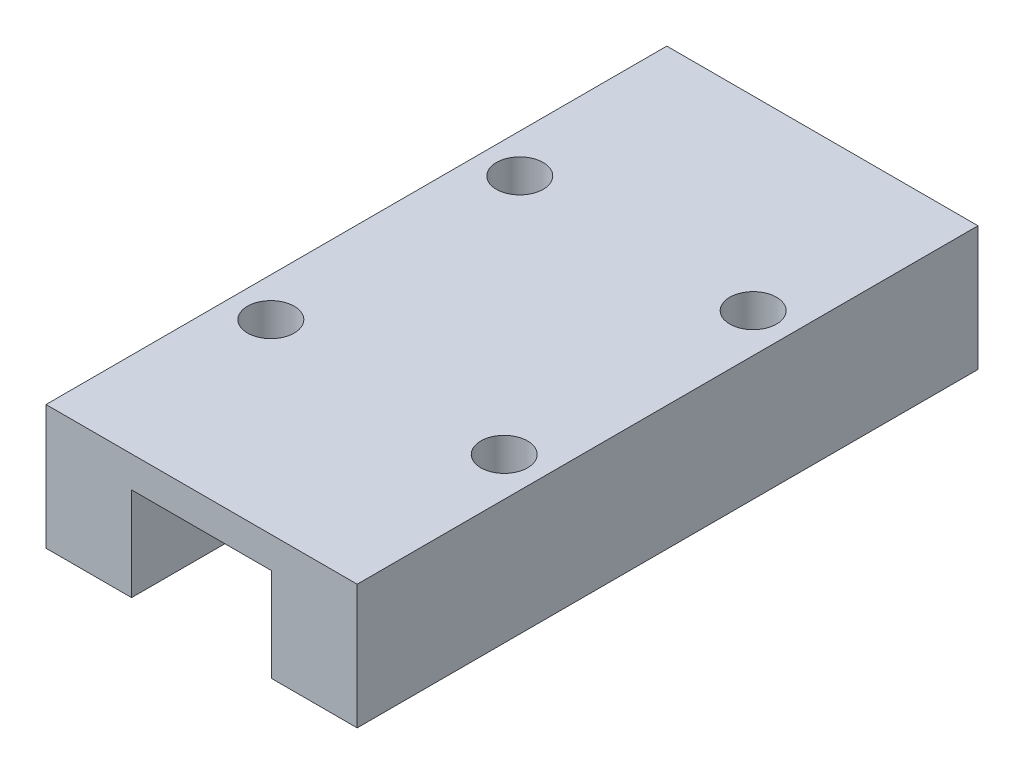
ISO-10303-21;
HEADER;
FILE_DESCRIPTION(('STEP AP214'),'2;1');
FILE_NAME('part.step','',(''),(''),'','','');
FILE_SCHEMA(('AUTOMOTIVE_DESIGN { 1 0 10303 214 1 1 1 1 }'));
ENDSEC;
DATA;
#1=APPLICATION_CONTEXT('core data for automotive mechanical design processes');
#2=APPLICATION_PROTOCOL_DEFINITION('international standard','automotive_design',2000,#1);
#3=PRODUCT_CONTEXT('',#1,'mechanical');
#4=PRODUCT('Part','Part','',(#3));
#5=PRODUCT_RELATED_PRODUCT_CATEGORY('part','',(#4));
#6=PRODUCT_DEFINITION_FORMATION('','',#4);
#7=PRODUCT_DEFINITION_CONTEXT('part definition',#1,'design');
#8=PRODUCT_DEFINITION('design','',#6,#7);
#9=PRODUCT_DEFINITION_SHAPE('','',#8);
#10=(LENGTH_UNIT() NAMED_UNIT(*) SI_UNIT(.MILLI.,.METRE.));
#11=(NAMED_UNIT(*) PLANE_ANGLE_UNIT() SI_UNIT($,.RADIAN.));
#12=(NAMED_UNIT(*) SI_UNIT($,.STERADIAN.) SOLID_ANGLE_UNIT());
#13=UNCERTAINTY_MEASURE_WITH_UNIT(LENGTH_MEASURE(1.E-05),#10,'distance_accuracy_value','');
#14=(GEOMETRIC_REPRESENTATION_CONTEXT(3) GLOBAL_UNCERTAINTY_ASSIGNED_CONTEXT((#13)) GLOBAL_UNIT_ASSIGNED_CONTEXT((#10,
#11,#12)) REPRESENTATION_CONTEXT('',''));
#15=CARTESIAN_POINT('',(0.,0.,0.));
#16=DIRECTION('',(0.,0.,1.));
#17=DIRECTION('',(1.,0.,0.));
#18=AXIS2_PLACEMENT_3D('',#15,#16,#17);
#19=CARTESIAN_POINT('',(0.,0.,0.));
#20=DIRECTION('',(0.,1.,0.));
#21=DIRECTION('',(0.,0.,1.));
#22=AXIS2_PLACEMENT_3D('',#19,#20,#21);
#23=PLANE('',#22);
#24=CARTESIAN_POINT('',(-7.5,0.,8.));
#25=DIRECTION('',(0.,1.,0.));
#26=DIRECTION('',(0.,0.,-1.));
#27=AXIS2_PLACEMENT_3D('',#24,#25,#26);
#28=CIRCLE('',#27,1.5);
#29=CARTESIAN_POINT('',(-7.5,0.,6.5));
#30=VERTEX_POINT('',#29);
#31=EDGE_CURVE('E189',#30,#30,#28,.T.);
#32=ORIENTED_EDGE('',*,*,#31,.T.);
#33=EDGE_LOOP('',(#32));
#34=FACE_BOUND('',#33,.T.);
#35=CARTESIAN_POINT('',(-7.5,0.,-8.));
#36=DIRECTION('',(0.,1.,0.));
#37=DIRECTION('',(0.,0.,1.));
#38=AXIS2_PLACEMENT_3D('',#35,#36,#37);
#39=CIRCLE('',#38,1.5);
#40=CARTESIAN_POINT('',(-7.5,0.,-6.5));
#41=VERTEX_POINT('',#40);
#42=EDGE_CURVE('E181',#41,#41,#39,.T.);
#43=ORIENTED_EDGE('',*,*,#42,.T.);
#44=EDGE_LOOP('',(#43));
#45=FACE_BOUND('',#44,.T.);
#46=DIRECTION('',(-1.,0.,0.));
#47=VECTOR('',#46,1.);
#48=CARTESIAN_POINT('',(-10.,0.,-19.95));
#49=LINE('',#48,#47);
#50=CARTESIAN_POINT('',(-4.5,0.,-19.95));
#51=VERTEX_POINT('',#50);
#52=CARTESIAN_POINT('',(-10.,0.,-19.95));
#53=VERTEX_POINT('',#52);
#54=EDGE_CURVE('E135',#51,#53,#49,.T.);
#55=ORIENTED_EDGE('',*,*,#54,.F.);
#56=DIRECTION('',(0.,0.,1.));
#57=VECTOR('',#56,1.);
#58=CARTESIAN_POINT('',(-4.5,0.,-40.05));
#59=LINE('',#58,#57);
#60=CARTESIAN_POINT('',(-4.5,0.,19.95));
#61=VERTEX_POINT('',#60);
#62=EDGE_CURVE('E120',#51,#61,#59,.T.);
#63=ORIENTED_EDGE('',*,*,#62,.T.);
#64=DIRECTION('',(1.,0.,0.));
#65=VECTOR('',#64,1.);
#66=CARTESIAN_POINT('',(-10.,0.,19.95));
#67=LINE('',#66,#65);
#68=CARTESIAN_POINT('',(-10.,0.,19.95));
#69=VERTEX_POINT('',#68);
#70=EDGE_CURVE('E134',#69,#61,#67,.T.);
#71=ORIENTED_EDGE('',*,*,#70,.F.);
#72=DIRECTION('',(0.,0.,1.));
#73=VECTOR('',#72,1.);
#74=CARTESIAN_POINT('',(-10.,0.,-19.95));
#75=LINE('',#74,#73);
#76=EDGE_CURVE('E149',#53,#69,#75,.T.);
#77=ORIENTED_EDGE('',*,*,#76,.F.);
#78=EDGE_LOOP('',(#55,#63,#71,#77));
#79=FACE_BOUND('',#78,.T.);
#80=ADVANCED_FACE('F43',(#34,#45,#79),#23,.F.);
#81=CARTESIAN_POINT('',(0.,8.,0.));
#82=DIRECTION('',(0.,1.,0.));
#83=DIRECTION('',(0.,0.,1.));
#84=AXIS2_PLACEMENT_3D('',#81,#82,#83);
#85=PLANE('',#84);
#86=CARTESIAN_POINT('',(7.5,8.,8.));
#87=DIRECTION('',(0.,1.,0.));
#88=DIRECTION('',(0.,0.,1.));
#89=AXIS2_PLACEMENT_3D('',#86,#87,#88);
#90=CIRCLE('',#89,1.5);
#91=CARTESIAN_POINT('',(7.5,8.,9.5));
#92=VERTEX_POINT('',#91);
#93=EDGE_CURVE('E193',#92,#92,#90,.T.);
#94=ORIENTED_EDGE('',*,*,#93,.F.);
#95=EDGE_LOOP('',(#94));
#96=FACE_BOUND('',#95,.T.);
#97=CARTESIAN_POINT('',(-7.5,8.,-8.));
#98=DIRECTION('',(0.,1.,0.));
#99=DIRECTION('',(0.,0.,1.));
#100=AXIS2_PLACEMENT_3D('',#97,#98,#99);
#101=CIRCLE('',#100,1.5);
#102=CARTESIAN_POINT('',(-7.5,8.,-6.5));
#103=VERTEX_POINT('',#102);
#104=EDGE_CURVE('E174',#103,#103,#101,.T.);
#105=ORIENTED_EDGE('',*,*,#104,.F.);
#106=EDGE_LOOP('',(#105));
#107=FACE_BOUND('',#106,.T.);
#108=DIRECTION('',(0.,0.,-1.));
#109=VECTOR('',#108,1.);
#110=CARTESIAN_POINT('',(10.,8.,-19.95));
#111=LINE('',#110,#109);
#112=CARTESIAN_POINT('',(10.,8.,19.95));
#113=VERTEX_POINT('',#112);
#114=CARTESIAN_POINT('',(10.,8.,-19.95));
#115=VERTEX_POINT('',#114);
#116=EDGE_CURVE('E144',#113,#115,#111,.T.);
#117=ORIENTED_EDGE('',*,*,#116,.T.);
#118=DIRECTION('',(-1.,0.,0.));
#119=VECTOR('',#118,1.);
#120=CARTESIAN_POINT('',(-10.,8.,-19.95));
#121=LINE('',#120,#119);
#122=CARTESIAN_POINT('',(-10.,8.,-19.95));
#123=VERTEX_POINT('',#122);
#124=EDGE_CURVE('E95',#115,#123,#121,.T.);
#125=ORIENTED_EDGE('',*,*,#124,.T.);
#126=DIRECTION('',(0.,0.,1.));
#127=VECTOR('',#126,1.);
#128=CARTESIAN_POINT('',(-10.,8.,-19.95));
#129=LINE('',#128,#127);
#130=CARTESIAN_POINT('',(-10.,8.,19.95));
#131=VERTEX_POINT('',#130);
#132=EDGE_CURVE('E162',#123,#131,#129,.T.);
#133=ORIENTED_EDGE('',*,*,#132,.T.);
#134=DIRECTION('',(1.,0.,0.));
#135=VECTOR('',#134,1.);
#136=CARTESIAN_POINT('',(-10.,8.,19.95));
#137=LINE('',#136,#135);
#138=EDGE_CURVE('E68',#131,#113,#137,.T.);
#139=ORIENTED_EDGE('',*,*,#138,.T.);
#140=EDGE_LOOP('',(#117,#125,#133,#139));
#141=FACE_BOUND('',#140,.T.);
#142=CARTESIAN_POINT('',(-7.5,8.,8.));
#143=DIRECTION('',(0.,1.,0.));
#144=DIRECTION('',(0.,0.,-1.));
#145=AXIS2_PLACEMENT_3D('',#142,#143,#144);
#146=CIRCLE('',#145,1.5);
#147=CARTESIAN_POINT('',(-7.5,8.,6.5));
#148=VERTEX_POINT('',#147);
#149=EDGE_CURVE('E185',#148,#148,#146,.T.);
#150=ORIENTED_EDGE('',*,*,#149,.F.);
#151=EDGE_LOOP('',(#150));
#152=FACE_BOUND('',#151,.T.);
#153=CARTESIAN_POINT('',(7.5,8.,-8.));
#154=DIRECTION('',(0.,1.,0.));
#155=DIRECTION('',(0.,0.,-1.));
#156=AXIS2_PLACEMENT_3D('',#153,#154,#155);
#157=CIRCLE('',#156,1.5);
#158=CARTESIAN_POINT('',(7.5,8.,-9.5));
#159=VERTEX_POINT('',#158);
#160=EDGE_CURVE('E201',#159,#159,#157,.T.);
#161=ORIENTED_EDGE('',*,*,#160,.F.);
#162=EDGE_LOOP('',(#161));
#163=FACE_BOUND('',#162,.T.);
#164=ADVANCED_FACE('F244',(#96,#107,#141,#152,#163),#85,.T.);
#165=CARTESIAN_POINT('',(4.5,0.,19.95));
#166=VERTEX_POINT('',#165);
#167=CARTESIAN_POINT('',(10.,0.,19.95));
#168=VERTEX_POINT('',#167);
#169=EDGE_CURVE('E88',#166,#168,#67,.T.);
#170=ORIENTED_EDGE('',*,*,#169,.F.);
#171=DIRECTION('',(0.,0.,1.));
#172=VECTOR('',#171,1.);
#173=CARTESIAN_POINT('',(4.5,0.,-40.05));
#174=LINE('',#173,#172);
#175=CARTESIAN_POINT('',(4.5,0.,-19.95));
#176=VERTEX_POINT('',#175);
#177=EDGE_CURVE('E59',#176,#166,#174,.T.);
#178=ORIENTED_EDGE('',*,*,#177,.F.);
#179=CARTESIAN_POINT('',(10.,0.,-19.95));
#180=VERTEX_POINT('',#179);
#181=EDGE_CURVE('E164',#180,#176,#49,.T.);
#182=ORIENTED_EDGE('',*,*,#181,.F.);
#183=DIRECTION('',(0.,0.,-1.));
#184=VECTOR('',#183,1.);
#185=CARTESIAN_POINT('',(10.,0.,-19.95));
#186=LINE('',#185,#184);
#187=EDGE_CURVE('E169',#168,#180,#186,.T.);
#188=ORIENTED_EDGE('',*,*,#187,.F.);
#189=EDGE_LOOP('',(#170,#178,#182,#188));
#190=FACE_BOUND('',#189,.T.);
#191=CARTESIAN_POINT('',(7.5,0.,8.));
#192=DIRECTION('',(0.,1.,0.));
#193=DIRECTION('',(0.,0.,1.));
#194=AXIS2_PLACEMENT_3D('',#191,#192,#193);
#195=CIRCLE('',#194,1.5);
#196=CARTESIAN_POINT('',(7.5,0.,9.5));
#197=VERTEX_POINT('',#196);
#198=EDGE_CURVE('E197',#197,#197,#195,.T.);
#199=ORIENTED_EDGE('',*,*,#198,.T.);
#200=EDGE_LOOP('',(#199));
#201=FACE_BOUND('',#200,.T.);
#202=CARTESIAN_POINT('',(7.5,0.,-8.));
#203=DIRECTION('',(0.,1.,0.));
#204=DIRECTION('',(0.,0.,-1.));
#205=AXIS2_PLACEMENT_3D('',#202,#203,#204);
#206=CIRCLE('',#205,1.5);
#207=CARTESIAN_POINT('',(7.5,0.,-9.5));
#208=VERTEX_POINT('',#207);
#209=EDGE_CURVE('E205',#208,#208,#206,.T.);
#210=ORIENTED_EDGE('',*,*,#209,.T.);
#211=EDGE_LOOP('',(#210));
#212=FACE_BOUND('',#211,.T.);
#213=ADVANCED_FACE('F238',(#190,#201,#212),#23,.F.);
#214=CARTESIAN_POINT('',(10.,8.,-19.95));
#215=DIRECTION('',(-1.,0.,0.));
#216=DIRECTION('',(0.,0.,1.));
#217=AXIS2_PLACEMENT_3D('',#214,#215,#216);
#218=PLANE('',#217);
#219=ORIENTED_EDGE('',*,*,#187,.T.);
#220=DIRECTION('',(0.,-1.,0.));
#221=VECTOR('',#220,1.);
#222=CARTESIAN_POINT('',(10.,8.,-19.95));
#223=LINE('',#222,#221);
#224=EDGE_CURVE('E11',#115,#180,#223,.T.);
#225=ORIENTED_EDGE('',*,*,#224,.F.);
#226=ORIENTED_EDGE('',*,*,#116,.F.);
#227=DIRECTION('',(0.,-1.,0.));
#228=VECTOR('',#227,1.);
#229=CARTESIAN_POINT('',(10.,8.,19.95));
#230=LINE('',#229,#228);
#231=EDGE_CURVE('E153',#113,#168,#230,.T.);
#232=ORIENTED_EDGE('',*,*,#231,.T.);
#233=EDGE_LOOP('',(#219,#225,#226,#232));
#234=FACE_BOUND('',#233,.T.);
#235=ADVANCED_FACE('F45',(#234),#218,.F.);
#236=CARTESIAN_POINT('',(-10.,8.,-19.95));
#237=DIRECTION('',(0.,0.,1.));
#238=DIRECTION('',(1.,0.,0.));
#239=AXIS2_PLACEMENT_3D('',#236,#237,#238);
#240=PLANE('',#239);
#241=DIRECTION('',(-1.,0.,0.));
#242=VECTOR('',#241,1.);
#243=CARTESIAN_POINT('',(-10.,6.,-19.95));
#244=LINE('',#243,#242);
#245=CARTESIAN_POINT('',(4.5,6.,-19.95));
#246=VERTEX_POINT('',#245);
#247=CARTESIAN_POINT('',(-4.5,6.,-19.95));
#248=VERTEX_POINT('',#247);
#249=EDGE_CURVE('E215',#246,#248,#244,.T.);
#250=ORIENTED_EDGE('',*,*,#249,.T.);
#251=DIRECTION('',(0.,-1.,0.));
#252=VECTOR('',#251,1.);
#253=CARTESIAN_POINT('',(-4.5,8.,-19.95));
#254=LINE('',#253,#252);
#255=EDGE_CURVE('E209',#248,#51,#254,.T.);
#256=ORIENTED_EDGE('',*,*,#255,.T.);
#257=ORIENTED_EDGE('',*,*,#54,.T.);
#258=DIRECTION('',(0.,-1.,0.));
#259=VECTOR('',#258,1.);
#260=CARTESIAN_POINT('',(-10.,8.,-19.95));
#261=LINE('',#260,#259);
#262=EDGE_CURVE('E52',#123,#53,#261,.T.);
#263=ORIENTED_EDGE('',*,*,#262,.F.);
#264=ORIENTED_EDGE('',*,*,#124,.F.);
#265=ORIENTED_EDGE('',*,*,#224,.T.);
#266=ORIENTED_EDGE('',*,*,#181,.T.);
#267=DIRECTION('',(0.,1.,0.));
#268=VECTOR('',#267,1.);
#269=CARTESIAN_POINT('',(4.5,8.,-19.95));
#270=LINE('',#269,#268);
#271=EDGE_CURVE('E219',#176,#246,#270,.T.);
#272=ORIENTED_EDGE('',*,*,#271,.T.);
#273=EDGE_LOOP('',(#250,#256,#257,#263,#264,#265,#266,#272));
#274=FACE_BOUND('',#273,.T.);
#275=ADVANCED_FACE('F236',(#274),#240,.F.);
#276=CARTESIAN_POINT('',(-10.,8.,-19.95));
#277=DIRECTION('',(1.,0.,0.));
#278=DIRECTION('',(0.,0.,-1.));
#279=AXIS2_PLACEMENT_3D('',#276,#277,#278);
#280=PLANE('',#279);
#281=ORIENTED_EDGE('',*,*,#76,.T.);
#282=DIRECTION('',(0.,-1.,0.));
#283=VECTOR('',#282,1.);
#284=CARTESIAN_POINT('',(-10.,8.,19.95));
#285=LINE('',#284,#283);
#286=EDGE_CURVE('E142',#131,#69,#285,.T.);
#287=ORIENTED_EDGE('',*,*,#286,.F.);
#288=ORIENTED_EDGE('',*,*,#132,.F.);
#289=ORIENTED_EDGE('',*,*,#262,.T.);
#290=EDGE_LOOP('',(#281,#287,#288,#289));
#291=FACE_BOUND('',#290,.T.);
#292=ADVANCED_FACE('F161',(#291),#280,.F.);
#293=CARTESIAN_POINT('',(-10.,8.,19.95));
#294=DIRECTION('',(0.,0.,-1.));
#295=DIRECTION('',(-1.,0.,0.));
#296=AXIS2_PLACEMENT_3D('',#293,#294,#295);
#297=PLANE('',#296);
#298=ORIENTED_EDGE('',*,*,#70,.T.);
#299=DIRECTION('',(0.,-1.,0.));
#300=VECTOR('',#299,1.);
#301=CARTESIAN_POINT('',(-4.5,0.,19.95));
#302=LINE('',#301,#300);
#303=CARTESIAN_POINT('',(-4.5,6.,19.95));
#304=VERTEX_POINT('',#303);
#305=EDGE_CURVE('E117',#304,#61,#302,.T.);
#306=ORIENTED_EDGE('',*,*,#305,.F.);
#307=DIRECTION('',(-1.,0.,0.));
#308=VECTOR('',#307,1.);
#309=CARTESIAN_POINT('',(-4.5,6.,19.95));
#310=LINE('',#309,#308);
#311=CARTESIAN_POINT('',(4.5,6.,19.95));
#312=VERTEX_POINT('',#311);
#313=EDGE_CURVE('E137',#312,#304,#310,.T.);
#314=ORIENTED_EDGE('',*,*,#313,.F.);
#315=DIRECTION('',(0.,1.,0.));
#316=VECTOR('',#315,1.);
#317=CARTESIAN_POINT('',(4.5,0.,19.95));
#318=LINE('',#317,#316);
#319=EDGE_CURVE('E128',#166,#312,#318,.T.);
#320=ORIENTED_EDGE('',*,*,#319,.F.);
#321=ORIENTED_EDGE('',*,*,#169,.T.);
#322=ORIENTED_EDGE('',*,*,#231,.F.);
#323=ORIENTED_EDGE('',*,*,#138,.F.);
#324=ORIENTED_EDGE('',*,*,#286,.T.);
#325=EDGE_LOOP('',(#298,#306,#314,#320,#321,#322,#323,#324));
#326=FACE_BOUND('',#325,.T.);
#327=ADVANCED_FACE('F140',(#326),#297,.F.);
#328=CARTESIAN_POINT('',(-7.5,8.,-8.));
#329=DIRECTION('',(0.,-1.,0.));
#330=DIRECTION('',(0.,0.,-1.));
#331=AXIS2_PLACEMENT_3D('',#328,#329,#330);
#332=CYLINDRICAL_SURFACE('',#331,1.5);
#333=ORIENTED_EDGE('',*,*,#104,.T.);
#334=EDGE_LOOP('',(#333));
#335=FACE_BOUND('',#334,.T.);
#336=ORIENTED_EDGE('',*,*,#42,.F.);
#337=EDGE_LOOP('',(#336));
#338=FACE_BOUND('',#337,.T.);
#339=ADVANCED_FACE('F274',(#335,#338),#332,.F.);
#340=CARTESIAN_POINT('',(-7.5,8.,8.));
#341=DIRECTION('',(0.,-1.,0.));
#342=DIRECTION('',(0.,0.,-1.));
#343=AXIS2_PLACEMENT_3D('',#340,#341,#342);
#344=CYLINDRICAL_SURFACE('',#343,1.5);
#345=ORIENTED_EDGE('',*,*,#149,.T.);
#346=EDGE_LOOP('',(#345));
#347=FACE_BOUND('',#346,.T.);
#348=ORIENTED_EDGE('',*,*,#31,.F.);
#349=EDGE_LOOP('',(#348));
#350=FACE_BOUND('',#349,.T.);
#351=ADVANCED_FACE('F276',(#347,#350),#344,.F.);
#352=CARTESIAN_POINT('',(7.5,8.,8.));
#353=DIRECTION('',(0.,-1.,0.));
#354=DIRECTION('',(0.,0.,-1.));
#355=AXIS2_PLACEMENT_3D('',#352,#353,#354);
#356=CYLINDRICAL_SURFACE('',#355,1.5);
#357=ORIENTED_EDGE('',*,*,#93,.T.);
#358=EDGE_LOOP('',(#357));
#359=FACE_BOUND('',#358,.T.);
#360=ORIENTED_EDGE('',*,*,#198,.F.);
#361=EDGE_LOOP('',(#360));
#362=FACE_BOUND('',#361,.T.);
#363=ADVANCED_FACE('F256',(#359,#362),#356,.F.);
#364=CARTESIAN_POINT('',(7.5,8.,-8.));
#365=DIRECTION('',(0.,-1.,0.));
#366=DIRECTION('',(0.,0.,-1.));
#367=AXIS2_PLACEMENT_3D('',#364,#365,#366);
#368=CYLINDRICAL_SURFACE('',#367,1.5);
#369=ORIENTED_EDGE('',*,*,#160,.T.);
#370=EDGE_LOOP('',(#369));
#371=FACE_BOUND('',#370,.T.);
#372=ORIENTED_EDGE('',*,*,#209,.F.);
#373=EDGE_LOOP('',(#372));
#374=FACE_BOUND('',#373,.T.);
#375=ADVANCED_FACE('F253',(#371,#374),#368,.F.);
#376=CARTESIAN_POINT('',(-4.5,0.,-40.05));
#377=DIRECTION('',(-1.,0.,0.));
#378=DIRECTION('',(0.,0.,1.));
#379=AXIS2_PLACEMENT_3D('',#376,#377,#378);
#380=PLANE('',#379);
#381=DIRECTION('',(0.,0.,1.));
#382=VECTOR('',#381,1.);
#383=CARTESIAN_POINT('',(-4.5,6.,-40.05));
#384=LINE('',#383,#382);
#385=EDGE_CURVE('E123',#248,#304,#384,.T.);
#386=ORIENTED_EDGE('',*,*,#385,.T.);
#387=ORIENTED_EDGE('',*,*,#305,.T.);
#388=ORIENTED_EDGE('',*,*,#62,.F.);
#389=ORIENTED_EDGE('',*,*,#255,.F.);
#390=EDGE_LOOP('',(#386,#387,#388,#389));
#391=FACE_BOUND('',#390,.T.);
#392=ADVANCED_FACE('F119',(#391),#380,.F.);
#393=CARTESIAN_POINT('',(-4.5,6.,-40.05));
#394=DIRECTION('',(0.,1.,0.));
#395=DIRECTION('',(0.,0.,1.));
#396=AXIS2_PLACEMENT_3D('',#393,#394,#395);
#397=PLANE('',#396);
#398=DIRECTION('',(0.,0.,1.));
#399=VECTOR('',#398,1.);
#400=CARTESIAN_POINT('',(4.5,6.,-40.05));
#401=LINE('',#400,#399);
#402=EDGE_CURVE('E224',#246,#312,#401,.T.);
#403=ORIENTED_EDGE('',*,*,#402,.T.);
#404=ORIENTED_EDGE('',*,*,#313,.T.);
#405=ORIENTED_EDGE('',*,*,#385,.F.);
#406=ORIENTED_EDGE('',*,*,#249,.F.);
#407=EDGE_LOOP('',(#403,#404,#405,#406));
#408=FACE_BOUND('',#407,.T.);
#409=ADVANCED_FACE('F235',(#408),#397,.F.);
#410=CARTESIAN_POINT('',(4.5,0.,-40.05));
#411=DIRECTION('',(1.,0.,0.));
#412=DIRECTION('',(0.,0.,-1.));
#413=AXIS2_PLACEMENT_3D('',#410,#411,#412);
#414=PLANE('',#413);
#415=ORIENTED_EDGE('',*,*,#177,.T.);
#416=ORIENTED_EDGE('',*,*,#319,.T.);
#417=ORIENTED_EDGE('',*,*,#402,.F.);
#418=ORIENTED_EDGE('',*,*,#271,.F.);
#419=EDGE_LOOP('',(#415,#416,#417,#418));
#420=FACE_BOUND('',#419,.T.);
#421=ADVANCED_FACE('F233',(#420),#414,.F.);
#422=CLOSED_SHELL('',(#80,#164,#213,#235,#275,#292,#327,#339,#351,#363,#375,#392,#409,#421));
#423=MANIFOLD_SOLID_BREP('B2',#422);
#424=ADVANCED_BREP_SHAPE_REPRESENTATION('',(#18,#423),#14);
#425=SHAPE_DEFINITION_REPRESENTATION(#9,#424);
ENDSEC;
END-ISO-10303-21;
